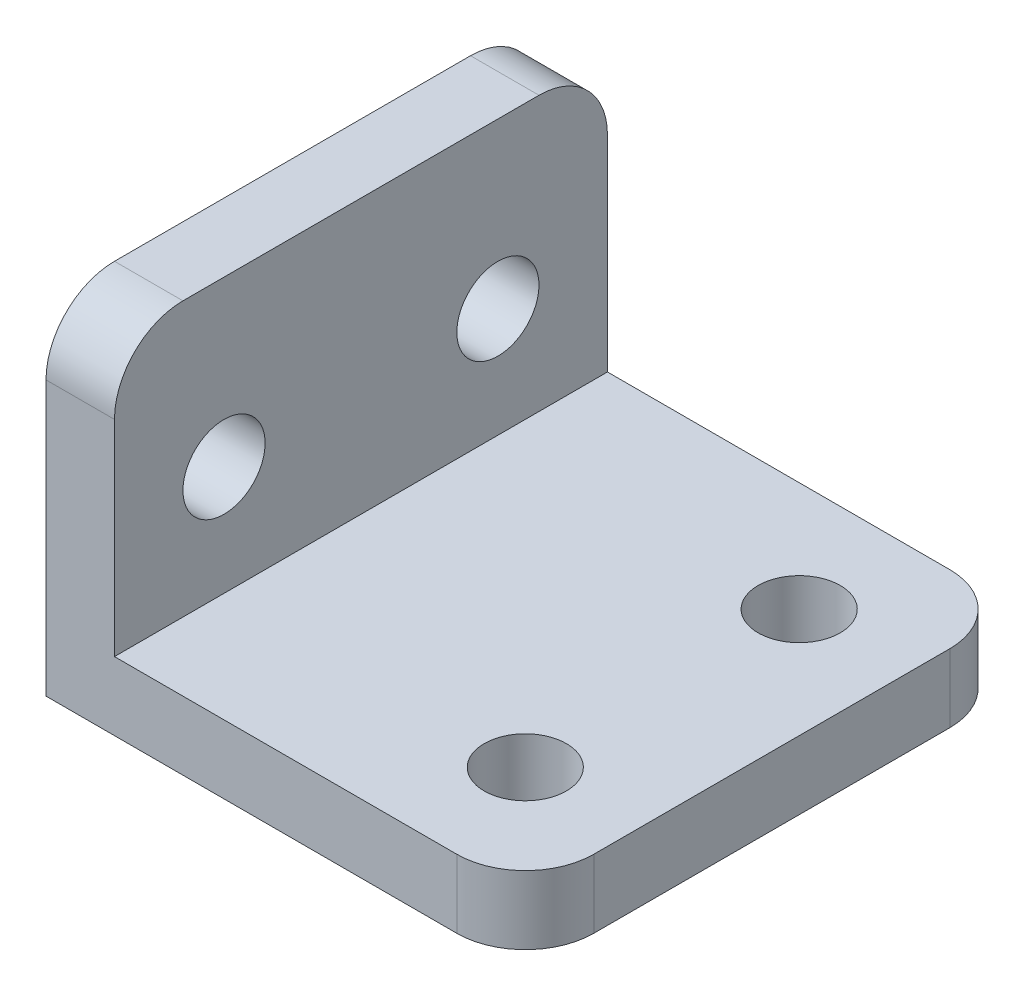
ISO-10303-21;
HEADER;
FILE_DESCRIPTION(('STEP AP214'),'2;1');
FILE_NAME('part.step','',(''),(''),'','','');
FILE_SCHEMA(('AUTOMOTIVE_DESIGN { 1 0 10303 214 1 1 1 1 }'));
ENDSEC;
DATA;
#1=APPLICATION_CONTEXT('core data for automotive mechanical design processes');
#2=APPLICATION_PROTOCOL_DEFINITION('international standard','automotive_design',2000,#1);
#3=PRODUCT_CONTEXT('',#1,'mechanical');
#4=PRODUCT('Part','Part','',(#3));
#5=PRODUCT_RELATED_PRODUCT_CATEGORY('part','',(#4));
#6=PRODUCT_DEFINITION_FORMATION('','',#4);
#7=PRODUCT_DEFINITION_CONTEXT('part definition',#1,'design');
#8=PRODUCT_DEFINITION('design','',#6,#7);
#9=PRODUCT_DEFINITION_SHAPE('','',#8);
#10=(LENGTH_UNIT() NAMED_UNIT(*) SI_UNIT(.MILLI.,.METRE.));
#11=(NAMED_UNIT(*) PLANE_ANGLE_UNIT() SI_UNIT($,.RADIAN.));
#12=(NAMED_UNIT(*) SI_UNIT($,.STERADIAN.) SOLID_ANGLE_UNIT());
#13=UNCERTAINTY_MEASURE_WITH_UNIT(LENGTH_MEASURE(1.E-05),#10,'distance_accuracy_value','');
#14=(GEOMETRIC_REPRESENTATION_CONTEXT(3) GLOBAL_UNCERTAINTY_ASSIGNED_CONTEXT((#13)) GLOBAL_UNIT_ASSIGNED_CONTEXT((#10,
#11,#12)) REPRESENTATION_CONTEXT('',''));
#15=CARTESIAN_POINT('',(0.,0.,0.));
#16=DIRECTION('',(0.,0.,1.));
#17=DIRECTION('',(1.,0.,0.));
#18=AXIS2_PLACEMENT_3D('',#15,#16,#17);
#19=CARTESIAN_POINT('',(-5.,19.095465901524,36.));
#20=DIRECTION('',(0.,-1.,0.));
#21=DIRECTION('',(0.,0.,-1.));
#22=AXIS2_PLACEMENT_3D('',#19,#20,#21);
#23=PLANE('',#22);
#24=DIRECTION('',(0.,0.,-1.));
#25=VECTOR('',#24,1.);
#26=CARTESIAN_POINT('',(0.,19.095465901524,36.));
#27=LINE('',#26,#25);
#28=CARTESIAN_POINT('',(0.,19.095465901524,31.));
#29=VERTEX_POINT('',#28);
#30=CARTESIAN_POINT('',(0.,19.095465901524,5.));
#31=VERTEX_POINT('',#30);
#32=EDGE_CURVE('E146',#29,#31,#27,.T.);
#33=ORIENTED_EDGE('',*,*,#32,.T.);
#34=DIRECTION('',(-1.,0.,0.));
#35=VECTOR('',#34,1.);
#36=CARTESIAN_POINT('',(-5.,19.095465901524,5.));
#37=LINE('',#36,#35);
#38=CARTESIAN_POINT('',(-5.,19.095465901524,5.));
#39=VERTEX_POINT('',#38);
#40=EDGE_CURVE('E184',#31,#39,#37,.T.);
#41=ORIENTED_EDGE('',*,*,#40,.T.);
#42=DIRECTION('',(0.,0.,-1.));
#43=VECTOR('',#42,1.);
#44=CARTESIAN_POINT('',(-5.,19.095465901524,36.));
#45=LINE('',#44,#43);
#46=CARTESIAN_POINT('',(-5.,19.095465901524,31.));
#47=VERTEX_POINT('',#46);
#48=EDGE_CURVE('E132',#47,#39,#45,.T.);
#49=ORIENTED_EDGE('',*,*,#48,.F.);
#50=DIRECTION('',(-1.,0.,0.));
#51=VECTOR('',#50,1.);
#52=CARTESIAN_POINT('',(-5.,19.095465901524,31.));
#53=LINE('',#52,#51);
#54=EDGE_CURVE('E52',#47,#29,#53,.F.);
#55=ORIENTED_EDGE('',*,*,#54,.T.);
#56=EDGE_LOOP('',(#33,#41,#49,#55));
#57=FACE_BOUND('',#56,.T.);
#58=ADVANCED_FACE('F32',(#57),#23,.F.);
#59=CARTESIAN_POINT('',(-4.99999999999999,-5.90453409847596,36.));
#60=DIRECTION('',(1.,0.,0.));
#61=DIRECTION('',(0.,1.,0.));
#62=AXIS2_PLACEMENT_3D('',#59,#60,#61);
#63=PLANE('',#62);
#64=CARTESIAN_POINT('',(-5.,7.09546590152404,8.));
#65=DIRECTION('',(1.,0.,0.));
#66=DIRECTION('',(0.,1.,0.));
#67=AXIS2_PLACEMENT_3D('',#64,#65,#66);
#68=CIRCLE('',#67,3.);
#69=CARTESIAN_POINT('',(-5.,10.095465901524,8.));
#70=VERTEX_POINT('',#69);
#71=EDGE_CURVE('E271',#70,#70,#68,.T.);
#72=ORIENTED_EDGE('',*,*,#71,.T.);
#73=EDGE_LOOP('',(#72));
#74=FACE_BOUND('',#73,.T.);
#75=CARTESIAN_POINT('',(-5.,7.09546590152404,28.));
#76=DIRECTION('',(1.,0.,0.));
#77=DIRECTION('',(0.,1.,0.));
#78=AXIS2_PLACEMENT_3D('',#75,#76,#77);
#79=CIRCLE('',#78,3.);
#80=CARTESIAN_POINT('',(-5.,10.095465901524,28.));
#81=VERTEX_POINT('',#80);
#82=EDGE_CURVE('E266',#81,#81,#79,.T.);
#83=ORIENTED_EDGE('',*,*,#82,.T.);
#84=EDGE_LOOP('',(#83));
#85=FACE_BOUND('',#84,.T.);
#86=ORIENTED_EDGE('',*,*,#48,.T.);
#87=CARTESIAN_POINT('',(-5.,14.095465901524,5.));
#88=DIRECTION('',(1.,0.,0.));
#89=DIRECTION('',(0.,1.,0.));
#90=AXIS2_PLACEMENT_3D('',#87,#88,#89);
#91=CIRCLE('',#90,5.);
#92=CARTESIAN_POINT('',(-5.,14.095465901524,0.));
#93=VERTEX_POINT('',#92);
#94=EDGE_CURVE('E189',#39,#93,#91,.F.);
#95=ORIENTED_EDGE('',*,*,#94,.T.);
#96=DIRECTION('',(0.,-1.,0.));
#97=VECTOR('',#96,1.);
#98=CARTESIAN_POINT('',(-4.99999999999999,-5.90453409847596,0.));
#99=LINE('',#98,#97);
#100=CARTESIAN_POINT('',(-4.99999999999999,-5.90453409847596,0.));
#101=VERTEX_POINT('',#100);
#102=EDGE_CURVE('E128',#93,#101,#99,.T.);
#103=ORIENTED_EDGE('',*,*,#102,.T.);
#104=DIRECTION('',(0.,0.,-1.));
#105=VECTOR('',#104,1.);
#106=CARTESIAN_POINT('',(-4.99999999999999,-5.90453409847596,36.));
#107=LINE('',#106,#105);
#108=CARTESIAN_POINT('',(-4.99999999999999,-5.90453409847596,36.));
#109=VERTEX_POINT('',#108);
#110=EDGE_CURVE('E124',#109,#101,#107,.T.);
#111=ORIENTED_EDGE('',*,*,#110,.F.);
#112=DIRECTION('',(0.,-1.,0.));
#113=VECTOR('',#112,1.);
#114=CARTESIAN_POINT('',(-4.99999999999999,-5.90453409847596,36.));
#115=LINE('',#114,#113);
#116=CARTESIAN_POINT('',(-5.,14.095465901524,36.));
#117=VERTEX_POINT('',#116);
#118=EDGE_CURVE('E110',#117,#109,#115,.T.);
#119=ORIENTED_EDGE('',*,*,#118,.F.);
#120=CARTESIAN_POINT('',(-5.,14.095465901524,31.));
#121=DIRECTION('',(1.,0.,0.));
#122=DIRECTION('',(0.,1.,0.));
#123=AXIS2_PLACEMENT_3D('',#120,#121,#122);
#124=CIRCLE('',#123,5.);
#125=EDGE_CURVE('E187',#117,#47,#124,.F.);
#126=ORIENTED_EDGE('',*,*,#125,.T.);
#127=EDGE_LOOP('',(#86,#95,#103,#111,#119,#126));
#128=FACE_BOUND('',#127,.T.);
#129=ADVANCED_FACE('F126',(#74,#85,#128),#63,.F.);
#130=CARTESIAN_POINT('',(30.,-5.90453409847596,36.));
#131=DIRECTION('',(0.,1.,0.));
#132=DIRECTION('',(-1.,0.,0.));
#133=AXIS2_PLACEMENT_3D('',#130,#131,#132);
#134=PLANE('',#133);
#135=CARTESIAN_POINT('',(22.,-5.90453409847596,28.));
#136=DIRECTION('',(0.,1.,0.));
#137=DIRECTION('',(-1.,0.,0.));
#138=AXIS2_PLACEMENT_3D('',#135,#136,#137);
#139=CIRCLE('',#138,3.);
#140=CARTESIAN_POINT('',(19.,-5.90453409847596,28.));
#141=VERTEX_POINT('',#140);
#142=EDGE_CURVE('E280',#141,#141,#139,.T.);
#143=ORIENTED_EDGE('',*,*,#142,.T.);
#144=EDGE_LOOP('',(#143));
#145=FACE_BOUND('',#144,.T.);
#146=CARTESIAN_POINT('',(22.,-5.90453409847596,8.));
#147=DIRECTION('',(0.,1.,0.));
#148=DIRECTION('',(-1.,0.,0.));
#149=AXIS2_PLACEMENT_3D('',#146,#147,#148);
#150=CIRCLE('',#149,3.);
#151=CARTESIAN_POINT('',(19.,-5.90453409847596,8.));
#152=VERTEX_POINT('',#151);
#153=EDGE_CURVE('E149',#152,#152,#150,.T.);
#154=ORIENTED_EDGE('',*,*,#153,.T.);
#155=EDGE_LOOP('',(#154));
#156=FACE_BOUND('',#155,.T.);
#157=DIRECTION('',(0.,0.,-1.));
#158=VECTOR('',#157,1.);
#159=CARTESIAN_POINT('',(30.,-5.90453409847596,36.));
#160=LINE('',#159,#158);
#161=CARTESIAN_POINT('',(30.,-5.90453409847596,31.));
#162=VERTEX_POINT('',#161);
#163=CARTESIAN_POINT('',(30.,-5.90453409847596,5.));
#164=VERTEX_POINT('',#163);
#165=EDGE_CURVE('E133',#162,#164,#160,.T.);
#166=ORIENTED_EDGE('',*,*,#165,.F.);
#167=CARTESIAN_POINT('',(25.,-5.90453409847596,31.));
#168=DIRECTION('',(0.,1.,0.));
#169=DIRECTION('',(-1.,0.,0.));
#170=AXIS2_PLACEMENT_3D('',#167,#168,#169);
#171=CIRCLE('',#170,5.);
#172=CARTESIAN_POINT('',(25.,-5.90453409847596,36.));
#173=VERTEX_POINT('',#172);
#174=EDGE_CURVE('E138',#162,#173,#171,.F.);
#175=ORIENTED_EDGE('',*,*,#174,.T.);
#176=DIRECTION('',(1.,0.,0.));
#177=VECTOR('',#176,1.);
#178=CARTESIAN_POINT('',(30.,-5.90453409847596,36.));
#179=LINE('',#178,#177);
#180=EDGE_CURVE('E115',#109,#173,#179,.T.);
#181=ORIENTED_EDGE('',*,*,#180,.F.);
#182=ORIENTED_EDGE('',*,*,#110,.T.);
#183=DIRECTION('',(1.,0.,0.));
#184=VECTOR('',#183,1.);
#185=CARTESIAN_POINT('',(30.,-5.90453409847596,0.));
#186=LINE('',#185,#184);
#187=CARTESIAN_POINT('',(25.,-5.90453409847596,0.));
#188=VERTEX_POINT('',#187);
#189=EDGE_CURVE('E148',#101,#188,#186,.T.);
#190=ORIENTED_EDGE('',*,*,#189,.T.);
#191=CARTESIAN_POINT('',(25.,-5.90453409847596,5.));
#192=DIRECTION('',(0.,1.,0.));
#193=DIRECTION('',(-1.,0.,0.));
#194=AXIS2_PLACEMENT_3D('',#191,#192,#193);
#195=CIRCLE('',#194,5.);
#196=EDGE_CURVE('E176',#188,#164,#195,.F.);
#197=ORIENTED_EDGE('',*,*,#196,.T.);
#198=EDGE_LOOP('',(#166,#175,#181,#182,#190,#197));
#199=FACE_BOUND('',#198,.T.);
#200=ADVANCED_FACE('F136',(#145,#156,#199),#134,.F.);
#201=CARTESIAN_POINT('',(30.,-0.904534098475957,36.));
#202=DIRECTION('',(-1.,0.,0.));
#203=DIRECTION('',(0.,-1.,0.));
#204=AXIS2_PLACEMENT_3D('',#201,#202,#203);
#205=PLANE('',#204);
#206=DIRECTION('',(0.,0.,-1.));
#207=VECTOR('',#206,1.);
#208=CARTESIAN_POINT('',(30.,-0.904534098475957,36.));
#209=LINE('',#208,#207);
#210=CARTESIAN_POINT('',(30.,-0.904534098475957,31.));
#211=VERTEX_POINT('',#210);
#212=CARTESIAN_POINT('',(30.,-0.904534098475957,5.));
#213=VERTEX_POINT('',#212);
#214=EDGE_CURVE('E158',#211,#213,#209,.T.);
#215=ORIENTED_EDGE('',*,*,#214,.F.);
#216=DIRECTION('',(0.,1.,0.));
#217=VECTOR('',#216,1.);
#218=CARTESIAN_POINT('',(30.,-0.904534098475957,31.));
#219=LINE('',#218,#217);
#220=EDGE_CURVE('E174',#211,#162,#219,.F.);
#221=ORIENTED_EDGE('',*,*,#220,.T.);
#222=ORIENTED_EDGE('',*,*,#165,.T.);
#223=DIRECTION('',(0.,1.,0.));
#224=VECTOR('',#223,1.);
#225=CARTESIAN_POINT('',(30.,-0.904534098475957,5.));
#226=LINE('',#225,#224);
#227=EDGE_CURVE('E171',#164,#213,#226,.T.);
#228=ORIENTED_EDGE('',*,*,#227,.T.);
#229=EDGE_LOOP('',(#215,#221,#222,#228));
#230=FACE_BOUND('',#229,.T.);
#231=ADVANCED_FACE('F211',(#230),#205,.F.);
#232=CARTESIAN_POINT('',(0.,-0.904534098475959,36.));
#233=DIRECTION('',(0.,-1.,0.));
#234=DIRECTION('',(1.,0.,0.));
#235=AXIS2_PLACEMENT_3D('',#232,#233,#234);
#236=PLANE('',#235);
#237=CARTESIAN_POINT('',(22.,-0.904534098475963,28.));
#238=DIRECTION('',(0.,1.,0.));
#239=DIRECTION('',(-1.,0.,0.));
#240=AXIS2_PLACEMENT_3D('',#237,#238,#239);
#241=CIRCLE('',#240,3.);
#242=CARTESIAN_POINT('',(19.,-0.904534098475963,28.));
#243=VERTEX_POINT('',#242);
#244=EDGE_CURVE('E273',#243,#243,#241,.T.);
#245=ORIENTED_EDGE('',*,*,#244,.F.);
#246=EDGE_LOOP('',(#245));
#247=FACE_BOUND('',#246,.T.);
#248=CARTESIAN_POINT('',(22.,-0.904534098475963,8.));
#249=DIRECTION('',(0.,1.,0.));
#250=DIRECTION('',(-1.,0.,0.));
#251=AXIS2_PLACEMENT_3D('',#248,#249,#250);
#252=CIRCLE('',#251,3.);
#253=CARTESIAN_POINT('',(19.,-0.904534098475963,8.));
#254=VERTEX_POINT('',#253);
#255=EDGE_CURVE('E283',#254,#254,#252,.T.);
#256=ORIENTED_EDGE('',*,*,#255,.F.);
#257=EDGE_LOOP('',(#256));
#258=FACE_BOUND('',#257,.T.);
#259=DIRECTION('',(-1.,0.,0.));
#260=VECTOR('',#259,1.);
#261=CARTESIAN_POINT('',(0.,-0.904534098475959,36.));
#262=LINE('',#261,#260);
#263=CARTESIAN_POINT('',(25.,-0.904534098475957,36.));
#264=VERTEX_POINT('',#263);
#265=CARTESIAN_POINT('',(0.,-0.904534098475959,36.));
#266=VERTEX_POINT('',#265);
#267=EDGE_CURVE('E139',#264,#266,#262,.T.);
#268=ORIENTED_EDGE('',*,*,#267,.F.);
#269=CARTESIAN_POINT('',(25.,-0.904534098475957,31.));
#270=DIRECTION('',(0.,-1.,0.));
#271=DIRECTION('',(1.,0.,0.));
#272=AXIS2_PLACEMENT_3D('',#269,#270,#271);
#273=CIRCLE('',#272,5.);
#274=EDGE_CURVE('E169',#264,#211,#273,.F.);
#275=ORIENTED_EDGE('',*,*,#274,.T.);
#276=ORIENTED_EDGE('',*,*,#214,.T.);
#277=CARTESIAN_POINT('',(25.,-0.904534098475957,5.));
#278=DIRECTION('',(0.,-1.,0.));
#279=DIRECTION('',(1.,0.,0.));
#280=AXIS2_PLACEMENT_3D('',#277,#278,#279);
#281=CIRCLE('',#280,5.);
#282=CARTESIAN_POINT('',(25.,-0.904534098475957,0.));
#283=VERTEX_POINT('',#282);
#284=EDGE_CURVE('E167',#213,#283,#281,.F.);
#285=ORIENTED_EDGE('',*,*,#284,.T.);
#286=DIRECTION('',(-1.,0.,0.));
#287=VECTOR('',#286,1.);
#288=CARTESIAN_POINT('',(0.,-0.904534098475959,0.));
#289=LINE('',#288,#287);
#290=CARTESIAN_POINT('',(0.,-0.904534098475959,0.));
#291=VERTEX_POINT('',#290);
#292=EDGE_CURVE('E151',#283,#291,#289,.T.);
#293=ORIENTED_EDGE('',*,*,#292,.T.);
#294=DIRECTION('',(0.,0.,-1.));
#295=VECTOR('',#294,1.);
#296=CARTESIAN_POINT('',(0.,-0.904534098475959,36.));
#297=LINE('',#296,#295);
#298=EDGE_CURVE('E155',#266,#291,#297,.T.);
#299=ORIENTED_EDGE('',*,*,#298,.F.);
#300=EDGE_LOOP('',(#268,#275,#276,#285,#293,#299));
#301=FACE_BOUND('',#300,.T.);
#302=ADVANCED_FACE('F214',(#247,#258,#301),#236,.F.);
#303=CARTESIAN_POINT('',(0.,19.095465901524,36.));
#304=DIRECTION('',(-1.,0.,0.));
#305=DIRECTION('',(0.,-1.,0.));
#306=AXIS2_PLACEMENT_3D('',#303,#304,#305);
#307=PLANE('',#306);
#308=CARTESIAN_POINT('',(0.,7.09546590152404,8.));
#309=DIRECTION('',(1.,0.,0.));
#310=DIRECTION('',(0.,1.,0.));
#311=AXIS2_PLACEMENT_3D('',#308,#309,#310);
#312=CIRCLE('',#311,3.);
#313=CARTESIAN_POINT('',(0.,10.095465901524,8.));
#314=VERTEX_POINT('',#313);
#315=EDGE_CURVE('E276',#314,#314,#312,.T.);
#316=ORIENTED_EDGE('',*,*,#315,.F.);
#317=EDGE_LOOP('',(#316));
#318=FACE_BOUND('',#317,.T.);
#319=CARTESIAN_POINT('',(0.,7.09546590152404,28.));
#320=DIRECTION('',(1.,0.,0.));
#321=DIRECTION('',(0.,1.,0.));
#322=AXIS2_PLACEMENT_3D('',#319,#320,#321);
#323=CIRCLE('',#322,3.);
#324=CARTESIAN_POINT('',(0.,10.095465901524,28.));
#325=VERTEX_POINT('',#324);
#326=EDGE_CURVE('E269',#325,#325,#323,.T.);
#327=ORIENTED_EDGE('',*,*,#326,.F.);
#328=EDGE_LOOP('',(#327));
#329=FACE_BOUND('',#328,.T.);
#330=DIRECTION('',(0.,1.,0.));
#331=VECTOR('',#330,1.);
#332=CARTESIAN_POINT('',(0.,19.095465901524,0.));
#333=LINE('',#332,#331);
#334=CARTESIAN_POINT('',(0.,14.095465901524,0.));
#335=VERTEX_POINT('',#334);
#336=EDGE_CURVE('E121',#291,#335,#333,.T.);
#337=ORIENTED_EDGE('',*,*,#336,.T.);
#338=CARTESIAN_POINT('',(0.,14.095465901524,5.));
#339=DIRECTION('',(-1.,0.,0.));
#340=DIRECTION('',(0.,-1.,0.));
#341=AXIS2_PLACEMENT_3D('',#338,#339,#340);
#342=CIRCLE('',#341,5.);
#343=EDGE_CURVE('E11',#335,#31,#342,.F.);
#344=ORIENTED_EDGE('',*,*,#343,.T.);
#345=ORIENTED_EDGE('',*,*,#32,.F.);
#346=CARTESIAN_POINT('',(0.,14.095465901524,31.));
#347=DIRECTION('',(-1.,0.,0.));
#348=DIRECTION('',(0.,-1.,0.));
#349=AXIS2_PLACEMENT_3D('',#346,#347,#348);
#350=CIRCLE('',#349,5.);
#351=CARTESIAN_POINT('',(0.,14.095465901524,36.));
#352=VERTEX_POINT('',#351);
#353=EDGE_CURVE('E40',#29,#352,#350,.F.);
#354=ORIENTED_EDGE('',*,*,#353,.T.);
#355=DIRECTION('',(0.,1.,0.));
#356=VECTOR('',#355,1.);
#357=CARTESIAN_POINT('',(0.,19.095465901524,36.));
#358=LINE('',#357,#356);
#359=EDGE_CURVE('E141',#266,#352,#358,.T.);
#360=ORIENTED_EDGE('',*,*,#359,.F.);
#361=ORIENTED_EDGE('',*,*,#298,.T.);
#362=EDGE_LOOP('',(#337,#344,#345,#354,#360,#361));
#363=FACE_BOUND('',#362,.T.);
#364=ADVANCED_FACE('F192',(#318,#329,#363),#307,.F.);
#365=CARTESIAN_POINT('',(0.,0.,36.));
#366=DIRECTION('',(0.,0.,-1.));
#367=DIRECTION('',(-1.,0.,0.));
#368=AXIS2_PLACEMENT_3D('',#365,#366,#367);
#369=PLANE('',#368);
#370=ORIENTED_EDGE('',*,*,#180,.T.);
#371=DIRECTION('',(0.,1.,0.));
#372=VECTOR('',#371,1.);
#373=CARTESIAN_POINT('',(25.,0.,36.));
#374=LINE('',#373,#372);
#375=EDGE_CURVE('E165',#173,#264,#374,.T.);
#376=ORIENTED_EDGE('',*,*,#375,.T.);
#377=ORIENTED_EDGE('',*,*,#267,.T.);
#378=ORIENTED_EDGE('',*,*,#359,.T.);
#379=DIRECTION('',(-1.,0.,0.));
#380=VECTOR('',#379,1.);
#381=CARTESIAN_POINT('',(0.,14.095465901524,36.));
#382=LINE('',#381,#380);
#383=EDGE_CURVE('E119',#352,#117,#382,.T.);
#384=ORIENTED_EDGE('',*,*,#383,.T.);
#385=ORIENTED_EDGE('',*,*,#118,.T.);
#386=EDGE_LOOP('',(#370,#376,#377,#378,#384,#385));
#387=FACE_BOUND('',#386,.T.);
#388=ADVANCED_FACE('F112',(#387),#369,.F.);
#389=CARTESIAN_POINT('',(0.,0.,0.));
#390=DIRECTION('',(0.,0.,-1.));
#391=DIRECTION('',(-1.,0.,0.));
#392=AXIS2_PLACEMENT_3D('',#389,#390,#391);
#393=PLANE('',#392);
#394=ORIENTED_EDGE('',*,*,#292,.F.);
#395=DIRECTION('',(0.,1.,0.));
#396=VECTOR('',#395,1.);
#397=CARTESIAN_POINT('',(25.,-5.90453409847596,0.));
#398=LINE('',#397,#396);
#399=EDGE_CURVE('E181',#283,#188,#398,.F.);
#400=ORIENTED_EDGE('',*,*,#399,.T.);
#401=ORIENTED_EDGE('',*,*,#189,.F.);
#402=ORIENTED_EDGE('',*,*,#102,.F.);
#403=DIRECTION('',(-1.,0.,0.));
#404=VECTOR('',#403,1.);
#405=CARTESIAN_POINT('',(0.,14.095465901524,0.));
#406=LINE('',#405,#404);
#407=EDGE_CURVE('E179',#93,#335,#406,.F.);
#408=ORIENTED_EDGE('',*,*,#407,.T.);
#409=ORIENTED_EDGE('',*,*,#336,.F.);
#410=EDGE_LOOP('',(#394,#400,#401,#402,#408,#409));
#411=FACE_BOUND('',#410,.T.);
#412=ADVANCED_FACE('F202',(#411),#393,.T.);
#413=CARTESIAN_POINT('',(22.,-5.90453409847596,8.));
#414=DIRECTION('',(0.,1.,0.));
#415=DIRECTION('',(-1.,0.,0.));
#416=AXIS2_PLACEMENT_3D('',#413,#414,#415);
#417=CYLINDRICAL_SURFACE('',#416,3.);
#418=ORIENTED_EDGE('',*,*,#153,.F.);
#419=EDGE_LOOP('',(#418));
#420=FACE_BOUND('',#419,.T.);
#421=ORIENTED_EDGE('',*,*,#255,.T.);
#422=EDGE_LOOP('',(#421));
#423=FACE_BOUND('',#422,.T.);
#424=ADVANCED_FACE('F249',(#420,#423),#417,.F.);
#425=CARTESIAN_POINT('',(22.,-5.90453409847596,28.));
#426=DIRECTION('',(0.,1.,0.));
#427=DIRECTION('',(-1.,0.,0.));
#428=AXIS2_PLACEMENT_3D('',#425,#426,#427);
#429=CYLINDRICAL_SURFACE('',#428,3.);
#430=ORIENTED_EDGE('',*,*,#142,.F.);
#431=EDGE_LOOP('',(#430));
#432=FACE_BOUND('',#431,.T.);
#433=ORIENTED_EDGE('',*,*,#244,.T.);
#434=EDGE_LOOP('',(#433));
#435=FACE_BOUND('',#434,.T.);
#436=ADVANCED_FACE('F254',(#432,#435),#429,.F.);
#437=CARTESIAN_POINT('',(-5.,7.09546590152404,28.));
#438=DIRECTION('',(1.,0.,0.));
#439=DIRECTION('',(0.,1.,0.));
#440=AXIS2_PLACEMENT_3D('',#437,#438,#439);
#441=CYLINDRICAL_SURFACE('',#440,3.);
#442=ORIENTED_EDGE('',*,*,#82,.F.);
#443=EDGE_LOOP('',(#442));
#444=FACE_BOUND('',#443,.T.);
#445=ORIENTED_EDGE('',*,*,#326,.T.);
#446=EDGE_LOOP('',(#445));
#447=FACE_BOUND('',#446,.T.);
#448=ADVANCED_FACE('F225',(#444,#447),#441,.F.);
#449=CARTESIAN_POINT('',(-5.,7.09546590152404,8.));
#450=DIRECTION('',(1.,0.,0.));
#451=DIRECTION('',(0.,1.,0.));
#452=AXIS2_PLACEMENT_3D('',#449,#450,#451);
#453=CYLINDRICAL_SURFACE('',#452,3.);
#454=ORIENTED_EDGE('',*,*,#71,.F.);
#455=EDGE_LOOP('',(#454));
#456=FACE_BOUND('',#455,.T.);
#457=ORIENTED_EDGE('',*,*,#315,.T.);
#458=EDGE_LOOP('',(#457));
#459=FACE_BOUND('',#458,.T.);
#460=ADVANCED_FACE('F218',(#456,#459),#453,.F.);
#461=CARTESIAN_POINT('',(25.,0.,31.));
#462=DIRECTION('',(0.,1.,0.));
#463=DIRECTION('',(-1.,0.,0.));
#464=AXIS2_PLACEMENT_3D('',#461,#462,#463);
#465=CYLINDRICAL_SURFACE('',#464,5.);
#466=ORIENTED_EDGE('',*,*,#174,.F.);
#467=ORIENTED_EDGE('',*,*,#220,.F.);
#468=ORIENTED_EDGE('',*,*,#274,.F.);
#469=ORIENTED_EDGE('',*,*,#375,.F.);
#470=EDGE_LOOP('',(#466,#467,#468,#469));
#471=FACE_BOUND('',#470,.T.);
#472=ADVANCED_FACE('F216',(#471),#465,.T.);
#473=CARTESIAN_POINT('',(25.,-0.904534098475964,5.));
#474=DIRECTION('',(0.,-1.,0.));
#475=DIRECTION('',(1.,0.,0.));
#476=AXIS2_PLACEMENT_3D('',#473,#474,#475);
#477=CYLINDRICAL_SURFACE('',#476,5.);
#478=ORIENTED_EDGE('',*,*,#196,.F.);
#479=ORIENTED_EDGE('',*,*,#399,.F.);
#480=ORIENTED_EDGE('',*,*,#284,.F.);
#481=ORIENTED_EDGE('',*,*,#227,.F.);
#482=EDGE_LOOP('',(#478,#479,#480,#481));
#483=FACE_BOUND('',#482,.T.);
#484=ADVANCED_FACE('F208',(#483),#477,.T.);
#485=CARTESIAN_POINT('',(-5.,14.095465901524,5.));
#486=DIRECTION('',(1.,0.,0.));
#487=DIRECTION('',(0.,0.,-1.));
#488=AXIS2_PLACEMENT_3D('',#485,#486,#487);
#489=CYLINDRICAL_SURFACE('',#488,5.);
#490=ORIENTED_EDGE('',*,*,#343,.F.);
#491=ORIENTED_EDGE('',*,*,#407,.F.);
#492=ORIENTED_EDGE('',*,*,#94,.F.);
#493=ORIENTED_EDGE('',*,*,#40,.F.);
#494=EDGE_LOOP('',(#490,#491,#492,#493));
#495=FACE_BOUND('',#494,.T.);
#496=ADVANCED_FACE('F198',(#495),#489,.T.);
#497=CARTESIAN_POINT('',(0.,14.095465901524,31.));
#498=DIRECTION('',(-1.,0.,0.));
#499=DIRECTION('',(0.,0.,1.));
#500=AXIS2_PLACEMENT_3D('',#497,#498,#499);
#501=CYLINDRICAL_SURFACE('',#500,5.);
#502=ORIENTED_EDGE('',*,*,#353,.F.);
#503=ORIENTED_EDGE('',*,*,#54,.F.);
#504=ORIENTED_EDGE('',*,*,#125,.F.);
#505=ORIENTED_EDGE('',*,*,#383,.F.);
#506=EDGE_LOOP('',(#502,#503,#504,#505));
#507=FACE_BOUND('',#506,.T.);
#508=ADVANCED_FACE('F34',(#507),#501,.T.);
#509=CLOSED_SHELL('',(#58,#129,#200,#231,#302,#364,#388,#412,#424,#436,#448,#460,#472,#484,#496,#508));
#510=MANIFOLD_SOLID_BREP('B2',#509);
#511=ADVANCED_BREP_SHAPE_REPRESENTATION('',(#18,#510),#14);
#512=SHAPE_DEFINITION_REPRESENTATION(#9,#511);
ENDSEC;
END-ISO-10303-21;
